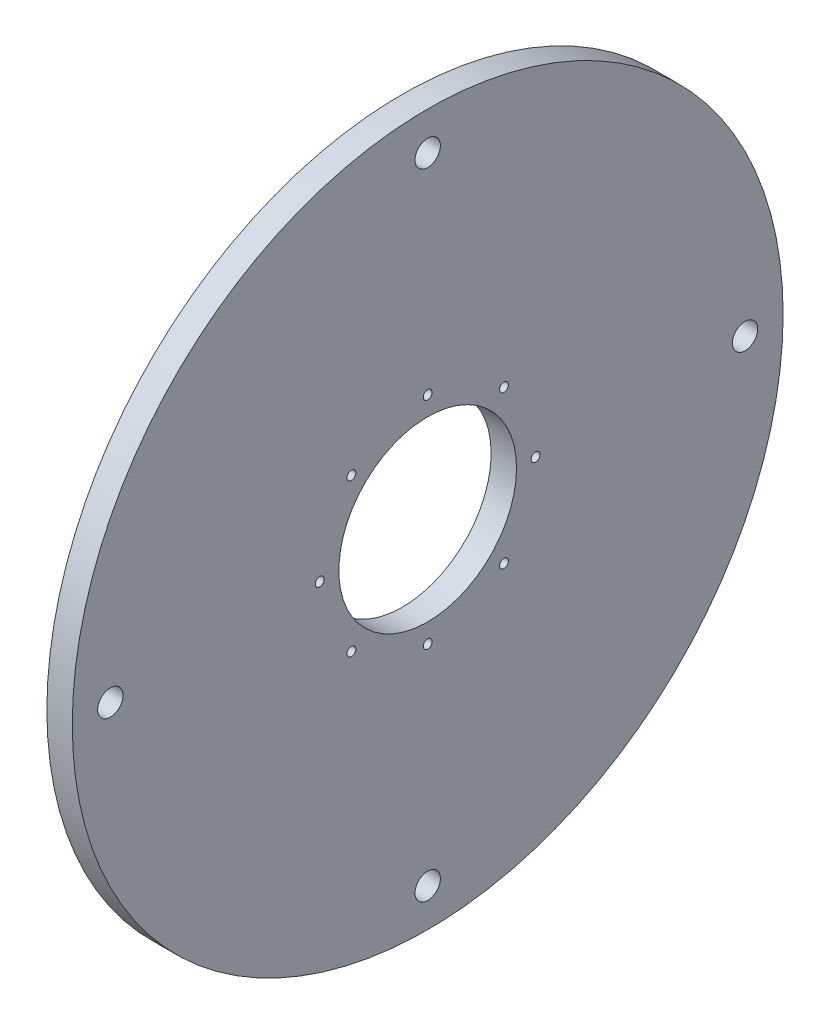
ISO-10303-21;
HEADER;
FILE_DESCRIPTION(('STEP AP214'),'2;1');
FILE_NAME('part.step','',(''),(''),'','','');
FILE_SCHEMA(('AUTOMOTIVE_DESIGN { 1 0 10303 214 1 1 1 1 }'));
ENDSEC;
DATA;
#1=APPLICATION_CONTEXT('core data for automotive mechanical design processes');
#2=APPLICATION_PROTOCOL_DEFINITION('international standard','automotive_design',2000,#1);
#3=PRODUCT_CONTEXT('',#1,'mechanical');
#4=PRODUCT('Part','Part','',(#3));
#5=PRODUCT_RELATED_PRODUCT_CATEGORY('part','',(#4));
#6=PRODUCT_DEFINITION_FORMATION('','',#4);
#7=PRODUCT_DEFINITION_CONTEXT('part definition',#1,'design');
#8=PRODUCT_DEFINITION('design','',#6,#7);
#9=PRODUCT_DEFINITION_SHAPE('','',#8);
#10=(LENGTH_UNIT() NAMED_UNIT(*) SI_UNIT(.MILLI.,.METRE.));
#11=(NAMED_UNIT(*) PLANE_ANGLE_UNIT() SI_UNIT($,.RADIAN.));
#12=(NAMED_UNIT(*) SI_UNIT($,.STERADIAN.) SOLID_ANGLE_UNIT());
#13=UNCERTAINTY_MEASURE_WITH_UNIT(LENGTH_MEASURE(1.E-05),#10,'distance_accuracy_value','');
#14=(GEOMETRIC_REPRESENTATION_CONTEXT(3) GLOBAL_UNCERTAINTY_ASSIGNED_CONTEXT((#13)) GLOBAL_UNIT_ASSIGNED_CONTEXT((#10,
#11,#12)) REPRESENTATION_CONTEXT('',''));
#15=CARTESIAN_POINT('',(0.,0.,0.));
#16=DIRECTION('',(0.,0.,1.));
#17=DIRECTION('',(1.,0.,0.));
#18=AXIS2_PLACEMENT_3D('',#15,#16,#17);
#19=CARTESIAN_POINT('',(10.,0.0933368993507634,67.4209521273336));
#20=DIRECTION('',(-1.,0.,0.));
#21=DIRECTION('',(0.,0.,1.));
#22=AXIS2_PLACEMENT_3D('',#19,#20,#21);
#23=CYLINDRICAL_SURFACE('',#22,1.75);
#24=CARTESIAN_POINT('',(10.,0.0933368993507634,67.4209521273336));
#25=DIRECTION('',(1.,0.,0.));
#26=DIRECTION('',(0.,0.,-1.));
#27=AXIS2_PLACEMENT_3D('',#24,#25,#26);
#28=CIRCLE('',#27,1.75);
#29=CARTESIAN_POINT('',(10.,0.0933368993507634,65.6709521273336));
#30=VERTEX_POINT('',#29);
#31=EDGE_CURVE('E44',#30,#30,#28,.T.);
#32=ORIENTED_EDGE('',*,*,#31,.T.);
#33=EDGE_LOOP('',(#32));
#34=FACE_BOUND('',#33,.T.);
#35=CARTESIAN_POINT('',(0.,0.0933368993507634,67.4209521273336));
#36=DIRECTION('',(1.,0.,0.));
#37=DIRECTION('',(0.,0.,-1.));
#38=AXIS2_PLACEMENT_3D('',#35,#36,#37);
#39=CIRCLE('',#38,1.75);
#40=CARTESIAN_POINT('',(0.,0.0933368993507634,65.6709521273336));
#41=VERTEX_POINT('',#40);
#42=EDGE_CURVE('E88',#41,#41,#39,.T.);
#43=ORIENTED_EDGE('',*,*,#42,.F.);
#44=EDGE_LOOP('',(#43));
#45=FACE_BOUND('',#44,.T.);
#46=ADVANCED_FACE('F36',(#34,#45),#23,.F.);
#47=CARTESIAN_POINT('',(10.,0.0933368993536736,24.9209521273336));
#48=DIRECTION('',(-1.,0.,0.));
#49=DIRECTION('',(0.,0.,1.));
#50=AXIS2_PLACEMENT_3D('',#47,#48,#49);
#51=CYLINDRICAL_SURFACE('',#50,140.);
#52=CARTESIAN_POINT('',(10.,0.0933368993536736,24.9209521273336));
#53=DIRECTION('',(1.,0.,0.));
#54=DIRECTION('',(0.,0.,-1.));
#55=AXIS2_PLACEMENT_3D('',#52,#53,#54);
#56=CIRCLE('',#55,140.);
#57=CARTESIAN_POINT('',(10.,0.0933368993536736,-115.079047872666));
#58=VERTEX_POINT('',#57);
#59=EDGE_CURVE('E49',#58,#58,#56,.T.);
#60=ORIENTED_EDGE('',*,*,#59,.F.);
#61=EDGE_LOOP('',(#60));
#62=FACE_BOUND('',#61,.T.);
#63=CARTESIAN_POINT('',(0.,0.0933368993536736,24.9209521273336));
#64=DIRECTION('',(1.,0.,0.));
#65=DIRECTION('',(0.,0.,-1.));
#66=AXIS2_PLACEMENT_3D('',#63,#64,#65);
#67=CIRCLE('',#66,140.);
#68=CARTESIAN_POINT('',(0.,0.0933368993536736,-115.079047872666));
#69=VERTEX_POINT('',#68);
#70=EDGE_CURVE('E86',#69,#69,#67,.T.);
#71=ORIENTED_EDGE('',*,*,#70,.T.);
#72=EDGE_LOOP('',(#71));
#73=FACE_BOUND('',#72,.T.);
#74=ADVANCED_FACE('F136',(#62,#73),#51,.T.);
#75=CARTESIAN_POINT('',(10.,0.0933368993540352,-100.079047872666));
#76=DIRECTION('',(-1.,0.,0.));
#77=DIRECTION('',(0.,0.,1.));
#78=AXIS2_PLACEMENT_3D('',#75,#76,#77);
#79=CYLINDRICAL_SURFACE('',#78,5.);
#80=CARTESIAN_POINT('',(10.,0.0933368993540352,-100.079047872666));
#81=DIRECTION('',(1.,0.,0.));
#82=DIRECTION('',(0.,0.,-1.));
#83=AXIS2_PLACEMENT_3D('',#80,#81,#82);
#84=CIRCLE('',#83,5.);
#85=CARTESIAN_POINT('',(10.,0.0933368993540352,-105.079047872666));
#86=VERTEX_POINT('',#85);
#87=EDGE_CURVE('E128',#86,#86,#84,.T.);
#88=ORIENTED_EDGE('',*,*,#87,.T.);
#89=EDGE_LOOP('',(#88));
#90=FACE_BOUND('',#89,.T.);
#91=CARTESIAN_POINT('',(0.,0.0933368993540352,-100.079047872666));
#92=DIRECTION('',(1.,0.,0.));
#93=DIRECTION('',(0.,0.,-1.));
#94=AXIS2_PLACEMENT_3D('',#91,#92,#93);
#95=CIRCLE('',#94,5.);
#96=CARTESIAN_POINT('',(0.,0.0933368993540352,-105.079047872666));
#97=VERTEX_POINT('',#96);
#98=EDGE_CURVE('E83',#97,#97,#95,.T.);
#99=ORIENTED_EDGE('',*,*,#98,.F.);
#100=EDGE_LOOP('',(#99));
#101=FACE_BOUND('',#100,.T.);
#102=ADVANCED_FACE('F139',(#90,#101),#79,.F.);
#103=CARTESIAN_POINT('',(10.,125.093336899354,24.920952127334));
#104=DIRECTION('',(-1.,0.,0.));
#105=DIRECTION('',(0.,0.,1.));
#106=AXIS2_PLACEMENT_3D('',#103,#104,#105);
#107=CYLINDRICAL_SURFACE('',#106,5.00000000000001);
#108=CARTESIAN_POINT('',(10.,125.093336899354,24.920952127334));
#109=DIRECTION('',(1.,0.,0.));
#110=DIRECTION('',(0.,0.,-1.));
#111=AXIS2_PLACEMENT_3D('',#108,#109,#110);
#112=CIRCLE('',#111,5.00000000000001);
#113=CARTESIAN_POINT('',(10.,125.093336899354,19.920952127334));
#114=VERTEX_POINT('',#113);
#115=EDGE_CURVE('E125',#114,#114,#112,.T.);
#116=ORIENTED_EDGE('',*,*,#115,.T.);
#117=EDGE_LOOP('',(#116));
#118=FACE_BOUND('',#117,.T.);
#119=CARTESIAN_POINT('',(0.,125.093336899354,24.920952127334));
#120=DIRECTION('',(1.,0.,0.));
#121=DIRECTION('',(0.,0.,-1.));
#122=AXIS2_PLACEMENT_3D('',#119,#120,#121);
#123=CIRCLE('',#122,5.00000000000001);
#124=CARTESIAN_POINT('',(0.,125.093336899354,19.920952127334));
#125=VERTEX_POINT('',#124);
#126=EDGE_CURVE('E80',#125,#125,#123,.T.);
#127=ORIENTED_EDGE('',*,*,#126,.F.);
#128=EDGE_LOOP('',(#127));
#129=FACE_BOUND('',#128,.T.);
#130=ADVANCED_FACE('F164',(#118,#129),#107,.F.);
#131=CARTESIAN_POINT('',(10.,0.0933368993533273,149.920952127334));
#132=DIRECTION('',(-1.,0.,0.));
#133=DIRECTION('',(0.,0.,1.));
#134=AXIS2_PLACEMENT_3D('',#131,#132,#133);
#135=CYLINDRICAL_SURFACE('',#134,5.00000000000002);
#136=CARTESIAN_POINT('',(10.,0.0933368993533273,149.920952127334));
#137=DIRECTION('',(1.,0.,0.));
#138=DIRECTION('',(0.,0.,-1.));
#139=AXIS2_PLACEMENT_3D('',#136,#137,#138);
#140=CIRCLE('',#139,5.00000000000002);
#141=CARTESIAN_POINT('',(10.,0.0933368993533273,144.920952127334));
#142=VERTEX_POINT('',#141);
#143=EDGE_CURVE('E122',#142,#142,#140,.T.);
#144=ORIENTED_EDGE('',*,*,#143,.T.);
#145=EDGE_LOOP('',(#144));
#146=FACE_BOUND('',#145,.T.);
#147=CARTESIAN_POINT('',(0.,0.0933368993533273,149.920952127334));
#148=DIRECTION('',(1.,0.,0.));
#149=DIRECTION('',(0.,0.,-1.));
#150=AXIS2_PLACEMENT_3D('',#147,#148,#149);
#151=CIRCLE('',#150,5.00000000000002);
#152=CARTESIAN_POINT('',(0.,0.0933368993533273,144.920952127334));
#153=VERTEX_POINT('',#152);
#154=EDGE_CURVE('E77',#153,#153,#151,.T.);
#155=ORIENTED_EDGE('',*,*,#154,.F.);
#156=EDGE_LOOP('',(#155));
#157=FACE_BOUND('',#156,.T.);
#158=ADVANCED_FACE('F168',(#146,#157),#135,.F.);
#159=CARTESIAN_POINT('',(10.,-124.906663100646,24.9209521273333));
#160=DIRECTION('',(-1.,0.,0.));
#161=DIRECTION('',(0.,0.,1.));
#162=AXIS2_PLACEMENT_3D('',#159,#160,#161);
#163=CYLINDRICAL_SURFACE('',#162,5.00000000000003);
#164=CARTESIAN_POINT('',(10.,-124.906663100646,24.9209521273333));
#165=DIRECTION('',(1.,0.,0.));
#166=DIRECTION('',(0.,0.,-1.));
#167=AXIS2_PLACEMENT_3D('',#164,#165,#166);
#168=CIRCLE('',#167,5.00000000000003);
#169=CARTESIAN_POINT('',(10.,-124.906663100646,19.9209521273332));
#170=VERTEX_POINT('',#169);
#171=EDGE_CURVE('E119',#170,#170,#168,.T.);
#172=ORIENTED_EDGE('',*,*,#171,.T.);
#173=EDGE_LOOP('',(#172));
#174=FACE_BOUND('',#173,.T.);
#175=CARTESIAN_POINT('',(0.,-124.906663100646,24.9209521273333));
#176=DIRECTION('',(1.,0.,0.));
#177=DIRECTION('',(0.,0.,-1.));
#178=AXIS2_PLACEMENT_3D('',#175,#176,#177);
#179=CIRCLE('',#178,5.00000000000003);
#180=CARTESIAN_POINT('',(0.,-124.906663100646,19.9209521273332));
#181=VERTEX_POINT('',#180);
#182=EDGE_CURVE('E74',#181,#181,#179,.T.);
#183=ORIENTED_EDGE('',*,*,#182,.F.);
#184=EDGE_LOOP('',(#183));
#185=FACE_BOUND('',#184,.T.);
#186=ADVANCED_FACE('F172',(#174,#185),#163,.F.);
#187=CARTESIAN_POINT('',(10.,-29.9587013010768,54.97299032776));
#188=DIRECTION('',(-1.,0.,0.));
#189=DIRECTION('',(0.,0.,1.));
#190=AXIS2_PLACEMENT_3D('',#187,#188,#189);
#191=CYLINDRICAL_SURFACE('',#190,1.75000000000001);
#192=CARTESIAN_POINT('',(10.,-29.9587013010768,54.97299032776));
#193=DIRECTION('',(1.,0.,0.));
#194=DIRECTION('',(0.,0.,-1.));
#195=AXIS2_PLACEMENT_3D('',#192,#193,#194);
#196=CIRCLE('',#195,1.75000000000001);
#197=CARTESIAN_POINT('',(10.,-29.9587013010768,53.22299032776));
#198=VERTEX_POINT('',#197);
#199=EDGE_CURVE('E116',#198,#198,#196,.T.);
#200=ORIENTED_EDGE('',*,*,#199,.T.);
#201=EDGE_LOOP('',(#200));
#202=FACE_BOUND('',#201,.T.);
#203=CARTESIAN_POINT('',(0.,-29.9587013010768,54.97299032776));
#204=DIRECTION('',(1.,0.,0.));
#205=DIRECTION('',(0.,0.,-1.));
#206=AXIS2_PLACEMENT_3D('',#203,#204,#205);
#207=CIRCLE('',#206,1.75000000000001);
#208=CARTESIAN_POINT('',(0.,-29.9587013010768,53.22299032776));
#209=VERTEX_POINT('',#208);
#210=EDGE_CURVE('E71',#209,#209,#207,.T.);
#211=ORIENTED_EDGE('',*,*,#210,.F.);
#212=EDGE_LOOP('',(#211));
#213=FACE_BOUND('',#212,.T.);
#214=ADVANCED_FACE('F176',(#202,#213),#191,.F.);
#215=CARTESIAN_POINT('',(10.,-42.4066631006467,24.9209521273309));
#216=DIRECTION('',(-1.,0.,0.));
#217=DIRECTION('',(0.,0.,1.));
#218=AXIS2_PLACEMENT_3D('',#215,#216,#217);
#219=CYLINDRICAL_SURFACE('',#218,1.75);
#220=CARTESIAN_POINT('',(10.,-42.4066631006467,24.9209521273309));
#221=DIRECTION('',(1.,0.,0.));
#222=DIRECTION('',(0.,0.,-1.));
#223=AXIS2_PLACEMENT_3D('',#220,#221,#222);
#224=CIRCLE('',#223,1.75);
#225=CARTESIAN_POINT('',(10.,-42.4066631006467,23.1709521273309));
#226=VERTEX_POINT('',#225);
#227=EDGE_CURVE('E113',#226,#226,#224,.T.);
#228=ORIENTED_EDGE('',*,*,#227,.T.);
#229=EDGE_LOOP('',(#228));
#230=FACE_BOUND('',#229,.T.);
#231=CARTESIAN_POINT('',(0.,-42.4066631006467,24.9209521273309));
#232=DIRECTION('',(1.,0.,0.));
#233=DIRECTION('',(0.,0.,-1.));
#234=AXIS2_PLACEMENT_3D('',#231,#232,#233);
#235=CIRCLE('',#234,1.75);
#236=CARTESIAN_POINT('',(0.,-42.4066631006467,23.1709521273309));
#237=VERTEX_POINT('',#236);
#238=EDGE_CURVE('E68',#237,#237,#235,.T.);
#239=ORIENTED_EDGE('',*,*,#238,.F.);
#240=EDGE_LOOP('',(#239));
#241=FACE_BOUND('',#240,.T.);
#242=ADVANCED_FACE('F180',(#230,#241),#219,.F.);
#243=CARTESIAN_POINT('',(10.,-29.958701301073,-5.13108607309665));
#244=DIRECTION('',(-1.,0.,0.));
#245=DIRECTION('',(0.,0.,1.));
#246=AXIS2_PLACEMENT_3D('',#243,#244,#245);
#247=CYLINDRICAL_SURFACE('',#246,1.75);
#248=CARTESIAN_POINT('',(10.,-29.958701301073,-5.13108607309665));
#249=DIRECTION('',(1.,0.,0.));
#250=DIRECTION('',(0.,0.,-1.));
#251=AXIS2_PLACEMENT_3D('',#248,#249,#250);
#252=CIRCLE('',#251,1.75);
#253=CARTESIAN_POINT('',(10.,-29.958701301073,-6.88108607309664));
#254=VERTEX_POINT('',#253);
#255=EDGE_CURVE('E110',#254,#254,#252,.T.);
#256=ORIENTED_EDGE('',*,*,#255,.T.);
#257=EDGE_LOOP('',(#256));
#258=FACE_BOUND('',#257,.T.);
#259=CARTESIAN_POINT('',(0.,-29.958701301073,-5.13108607309665));
#260=DIRECTION('',(1.,0.,0.));
#261=DIRECTION('',(0.,0.,-1.));
#262=AXIS2_PLACEMENT_3D('',#259,#260,#261);
#263=CIRCLE('',#262,1.75);
#264=CARTESIAN_POINT('',(0.,-29.958701301073,-6.88108607309664));
#265=VERTEX_POINT('',#264);
#266=EDGE_CURVE('E65',#265,#265,#263,.T.);
#267=ORIENTED_EDGE('',*,*,#266,.F.);
#268=EDGE_LOOP('',(#267));
#269=FACE_BOUND('',#268,.T.);
#270=ADVANCED_FACE('F184',(#258,#269),#247,.F.);
#271=CARTESIAN_POINT('',(10.,0.0933368993561688,-17.5790478726664));
#272=DIRECTION('',(-1.,0.,0.));
#273=DIRECTION('',(0.,0.,1.));
#274=AXIS2_PLACEMENT_3D('',#271,#272,#273);
#275=CYLINDRICAL_SURFACE('',#274,1.75);
#276=CARTESIAN_POINT('',(10.,0.0933368993561688,-17.5790478726664));
#277=DIRECTION('',(1.,0.,0.));
#278=DIRECTION('',(0.,0.,-1.));
#279=AXIS2_PLACEMENT_3D('',#276,#277,#278);
#280=CIRCLE('',#279,1.75);
#281=CARTESIAN_POINT('',(10.,0.0933368993561688,-19.3290478726664));
#282=VERTEX_POINT('',#281);
#283=EDGE_CURVE('E107',#282,#282,#280,.T.);
#284=ORIENTED_EDGE('',*,*,#283,.T.);
#285=EDGE_LOOP('',(#284));
#286=FACE_BOUND('',#285,.T.);
#287=CARTESIAN_POINT('',(0.,0.0933368993561688,-17.5790478726664));
#288=DIRECTION('',(1.,0.,0.));
#289=DIRECTION('',(0.,0.,-1.));
#290=AXIS2_PLACEMENT_3D('',#287,#288,#289);
#291=CIRCLE('',#290,1.75);
#292=CARTESIAN_POINT('',(0.,0.0933368993561688,-19.3290478726664));
#293=VERTEX_POINT('',#292);
#294=EDGE_CURVE('E62',#293,#293,#291,.T.);
#295=ORIENTED_EDGE('',*,*,#294,.F.);
#296=EDGE_LOOP('',(#295));
#297=FACE_BOUND('',#296,.T.);
#298=ADVANCED_FACE('F188',(#286,#297),#275,.F.);
#299=CARTESIAN_POINT('',(10.,30.1453750997837,-5.1310860730926));
#300=DIRECTION('',(-1.,0.,0.));
#301=DIRECTION('',(0.,0.,1.));
#302=AXIS2_PLACEMENT_3D('',#299,#300,#301);
#303=CYLINDRICAL_SURFACE('',#302,1.75);
#304=CARTESIAN_POINT('',(10.,30.1453750997837,-5.1310860730926));
#305=DIRECTION('',(1.,0.,0.));
#306=DIRECTION('',(0.,0.,-1.));
#307=AXIS2_PLACEMENT_3D('',#304,#305,#306);
#308=CIRCLE('',#307,1.75);
#309=CARTESIAN_POINT('',(10.,30.1453750997837,-6.8810860730926));
#310=VERTEX_POINT('',#309);
#311=EDGE_CURVE('E102',#310,#310,#308,.T.);
#312=ORIENTED_EDGE('',*,*,#311,.T.);
#313=EDGE_LOOP('',(#312));
#314=FACE_BOUND('',#313,.T.);
#315=CARTESIAN_POINT('',(0.,30.1453750997837,-5.1310860730926));
#316=DIRECTION('',(1.,0.,0.));
#317=DIRECTION('',(0.,0.,-1.));
#318=AXIS2_PLACEMENT_3D('',#315,#316,#317);
#319=CIRCLE('',#318,1.75);
#320=CARTESIAN_POINT('',(0.,30.1453750997837,-6.8810860730926));
#321=VERTEX_POINT('',#320);
#322=EDGE_CURVE('E59',#321,#321,#319,.T.);
#323=ORIENTED_EDGE('',*,*,#322,.F.);
#324=EDGE_LOOP('',(#323));
#325=FACE_BOUND('',#324,.T.);
#326=ADVANCED_FACE('F192',(#314,#325),#303,.F.);
#327=CARTESIAN_POINT('',(10.,42.5933368993533,24.9209521273366));
#328=DIRECTION('',(-1.,0.,0.));
#329=DIRECTION('',(0.,0.,1.));
#330=AXIS2_PLACEMENT_3D('',#327,#328,#329);
#331=CYLINDRICAL_SURFACE('',#330,1.75);
#332=CARTESIAN_POINT('',(10.,42.5933368993533,24.9209521273366));
#333=DIRECTION('',(1.,0.,0.));
#334=DIRECTION('',(0.,0.,-1.));
#335=AXIS2_PLACEMENT_3D('',#332,#333,#334);
#336=CIRCLE('',#335,1.75);
#337=CARTESIAN_POINT('',(10.,42.5933368993533,23.1709521273366));
#338=VERTEX_POINT('',#337);
#339=EDGE_CURVE('E97',#338,#338,#336,.T.);
#340=ORIENTED_EDGE('',*,*,#339,.T.);
#341=EDGE_LOOP('',(#340));
#342=FACE_BOUND('',#341,.T.);
#343=CARTESIAN_POINT('',(0.,42.5933368993533,24.9209521273366));
#344=DIRECTION('',(1.,0.,0.));
#345=DIRECTION('',(0.,0.,-1.));
#346=AXIS2_PLACEMENT_3D('',#343,#344,#345);
#347=CIRCLE('',#346,1.75);
#348=CARTESIAN_POINT('',(0.,42.5933368993533,23.1709521273366));
#349=VERTEX_POINT('',#348);
#350=EDGE_CURVE('E56',#349,#349,#347,.T.);
#351=ORIENTED_EDGE('',*,*,#350,.F.);
#352=EDGE_LOOP('',(#351));
#353=FACE_BOUND('',#352,.T.);
#354=ADVANCED_FACE('F195',(#342,#353),#331,.F.);
#355=CARTESIAN_POINT('',(10.,30.1453750997798,54.9729903277636));
#356=DIRECTION('',(-1.,0.,0.));
#357=DIRECTION('',(0.,0.,1.));
#358=AXIS2_PLACEMENT_3D('',#355,#356,#357);
#359=CYLINDRICAL_SURFACE('',#358,1.75);
#360=CARTESIAN_POINT('',(10.,30.1453750997798,54.9729903277636));
#361=DIRECTION('',(1.,0.,0.));
#362=DIRECTION('',(0.,0.,-1.));
#363=AXIS2_PLACEMENT_3D('',#360,#361,#362);
#364=CIRCLE('',#363,1.75);
#365=CARTESIAN_POINT('',(10.,30.1453750997798,53.2229903277636));
#366=VERTEX_POINT('',#365);
#367=EDGE_CURVE('E93',#366,#366,#364,.T.);
#368=ORIENTED_EDGE('',*,*,#367,.T.);
#369=EDGE_LOOP('',(#368));
#370=FACE_BOUND('',#369,.T.);
#371=CARTESIAN_POINT('',(0.,30.1453750997798,54.9729903277636));
#372=DIRECTION('',(1.,0.,0.));
#373=DIRECTION('',(0.,0.,-1.));
#374=AXIS2_PLACEMENT_3D('',#371,#372,#373);
#375=CIRCLE('',#374,1.75);
#376=CARTESIAN_POINT('',(0.,30.1453750997798,53.2229903277636));
#377=VERTEX_POINT('',#376);
#378=EDGE_CURVE('E53',#377,#377,#375,.T.);
#379=ORIENTED_EDGE('',*,*,#378,.F.);
#380=EDGE_LOOP('',(#379));
#381=FACE_BOUND('',#380,.T.);
#382=ADVANCED_FACE('F38',(#370,#381),#359,.F.);
#383=CARTESIAN_POINT('',(10.,0.0933368993536736,24.9209521273336));
#384=DIRECTION('',(-1.,0.,0.));
#385=DIRECTION('',(0.,0.,1.));
#386=AXIS2_PLACEMENT_3D('',#383,#384,#385);
#387=CYLINDRICAL_SURFACE('',#386,35.);
#388=CARTESIAN_POINT('',(10.,0.0933368993536736,24.9209521273336));
#389=DIRECTION('',(1.,0.,0.));
#390=DIRECTION('',(0.,0.,-1.));
#391=AXIS2_PLACEMENT_3D('',#388,#389,#390);
#392=CIRCLE('',#391,35.);
#393=CARTESIAN_POINT('',(10.,0.0933368993536736,-10.0790478726664));
#394=VERTEX_POINT('',#393);
#395=EDGE_CURVE('E10',#394,#394,#392,.T.);
#396=ORIENTED_EDGE('',*,*,#395,.T.);
#397=EDGE_LOOP('',(#396));
#398=FACE_BOUND('',#397,.T.);
#399=CARTESIAN_POINT('',(0.,0.0933368993536736,24.9209521273336));
#400=DIRECTION('',(1.,0.,0.));
#401=DIRECTION('',(0.,0.,-1.));
#402=AXIS2_PLACEMENT_3D('',#399,#400,#401);
#403=CIRCLE('',#402,35.);
#404=CARTESIAN_POINT('',(0.,0.0933368993536736,-10.0790478726664));
#405=VERTEX_POINT('',#404);
#406=EDGE_CURVE('E40',#405,#405,#403,.T.);
#407=ORIENTED_EDGE('',*,*,#406,.F.);
#408=EDGE_LOOP('',(#407));
#409=FACE_BOUND('',#408,.T.);
#410=ADVANCED_FACE('F150',(#398,#409),#387,.F.);
#411=CARTESIAN_POINT('',(10.,0.,0.));
#412=DIRECTION('',(1.,0.,0.));
#413=DIRECTION('',(0.,0.,-1.));
#414=AXIS2_PLACEMENT_3D('',#411,#412,#413);
#415=PLANE('',#414);
#416=ORIENTED_EDGE('',*,*,#367,.F.);
#417=EDGE_LOOP('',(#416));
#418=FACE_BOUND('',#417,.T.);
#419=ORIENTED_EDGE('',*,*,#339,.F.);
#420=EDGE_LOOP('',(#419));
#421=FACE_BOUND('',#420,.T.);
#422=ORIENTED_EDGE('',*,*,#311,.F.);
#423=EDGE_LOOP('',(#422));
#424=FACE_BOUND('',#423,.T.);
#425=ORIENTED_EDGE('',*,*,#283,.F.);
#426=EDGE_LOOP('',(#425));
#427=FACE_BOUND('',#426,.T.);
#428=ORIENTED_EDGE('',*,*,#255,.F.);
#429=EDGE_LOOP('',(#428));
#430=FACE_BOUND('',#429,.T.);
#431=ORIENTED_EDGE('',*,*,#227,.F.);
#432=EDGE_LOOP('',(#431));
#433=FACE_BOUND('',#432,.T.);
#434=ORIENTED_EDGE('',*,*,#199,.F.);
#435=EDGE_LOOP('',(#434));
#436=FACE_BOUND('',#435,.T.);
#437=ORIENTED_EDGE('',*,*,#171,.F.);
#438=EDGE_LOOP('',(#437));
#439=FACE_BOUND('',#438,.T.);
#440=ORIENTED_EDGE('',*,*,#143,.F.);
#441=EDGE_LOOP('',(#440));
#442=FACE_BOUND('',#441,.T.);
#443=ORIENTED_EDGE('',*,*,#115,.F.);
#444=EDGE_LOOP('',(#443));
#445=FACE_BOUND('',#444,.T.);
#446=ORIENTED_EDGE('',*,*,#87,.F.);
#447=EDGE_LOOP('',(#446));
#448=FACE_BOUND('',#447,.T.);
#449=ORIENTED_EDGE('',*,*,#59,.T.);
#450=EDGE_LOOP('',(#449));
#451=FACE_BOUND('',#450,.T.);
#452=ORIENTED_EDGE('',*,*,#31,.F.);
#453=EDGE_LOOP('',(#452));
#454=FACE_BOUND('',#453,.T.);
#455=ORIENTED_EDGE('',*,*,#395,.F.);
#456=EDGE_LOOP('',(#455));
#457=FACE_BOUND('',#456,.T.);
#458=ADVANCED_FACE('F133',(#418,#421,#424,#427,#430,#433,#436,#439,#442,#445,#448,#451,#454,
#457),#415,.T.);
#459=CARTESIAN_POINT('',(0.,0.,0.));
#460=DIRECTION('',(1.,0.,0.));
#461=DIRECTION('',(0.,0.,-1.));
#462=AXIS2_PLACEMENT_3D('',#459,#460,#461);
#463=PLANE('',#462);
#464=ORIENTED_EDGE('',*,*,#378,.T.);
#465=EDGE_LOOP('',(#464));
#466=FACE_BOUND('',#465,.T.);
#467=ORIENTED_EDGE('',*,*,#350,.T.);
#468=EDGE_LOOP('',(#467));
#469=FACE_BOUND('',#468,.T.);
#470=ORIENTED_EDGE('',*,*,#322,.T.);
#471=EDGE_LOOP('',(#470));
#472=FACE_BOUND('',#471,.T.);
#473=ORIENTED_EDGE('',*,*,#294,.T.);
#474=EDGE_LOOP('',(#473));
#475=FACE_BOUND('',#474,.T.);
#476=ORIENTED_EDGE('',*,*,#266,.T.);
#477=EDGE_LOOP('',(#476));
#478=FACE_BOUND('',#477,.T.);
#479=ORIENTED_EDGE('',*,*,#238,.T.);
#480=EDGE_LOOP('',(#479));
#481=FACE_BOUND('',#480,.T.);
#482=ORIENTED_EDGE('',*,*,#210,.T.);
#483=EDGE_LOOP('',(#482));
#484=FACE_BOUND('',#483,.T.);
#485=ORIENTED_EDGE('',*,*,#182,.T.);
#486=EDGE_LOOP('',(#485));
#487=FACE_BOUND('',#486,.T.);
#488=ORIENTED_EDGE('',*,*,#154,.T.);
#489=EDGE_LOOP('',(#488));
#490=FACE_BOUND('',#489,.T.);
#491=ORIENTED_EDGE('',*,*,#126,.T.);
#492=EDGE_LOOP('',(#491));
#493=FACE_BOUND('',#492,.T.);
#494=ORIENTED_EDGE('',*,*,#98,.T.);
#495=EDGE_LOOP('',(#494));
#496=FACE_BOUND('',#495,.T.);
#497=ORIENTED_EDGE('',*,*,#70,.F.);
#498=EDGE_LOOP('',(#497));
#499=FACE_BOUND('',#498,.T.);
#500=ORIENTED_EDGE('',*,*,#42,.T.);
#501=EDGE_LOOP('',(#500));
#502=FACE_BOUND('',#501,.T.);
#503=ORIENTED_EDGE('',*,*,#406,.T.);
#504=EDGE_LOOP('',(#503));
#505=FACE_BOUND('',#504,.T.);
#506=ADVANCED_FACE('F143',(#466,#469,#472,#475,#478,#481,#484,#487,#490,#493,#496,#499,#502,
#505),#463,.F.);
#507=CLOSED_SHELL('',(#46,#74,#102,#130,#158,#186,#214,#242,#270,#298,#326,#354,#382,#410,#458,#506));
#508=MANIFOLD_SOLID_BREP('B2',#507);
#509=ADVANCED_BREP_SHAPE_REPRESENTATION('',(#18,#508),#14);
#510=SHAPE_DEFINITION_REPRESENTATION(#9,#509);
ENDSEC;
END-ISO-10303-21;
